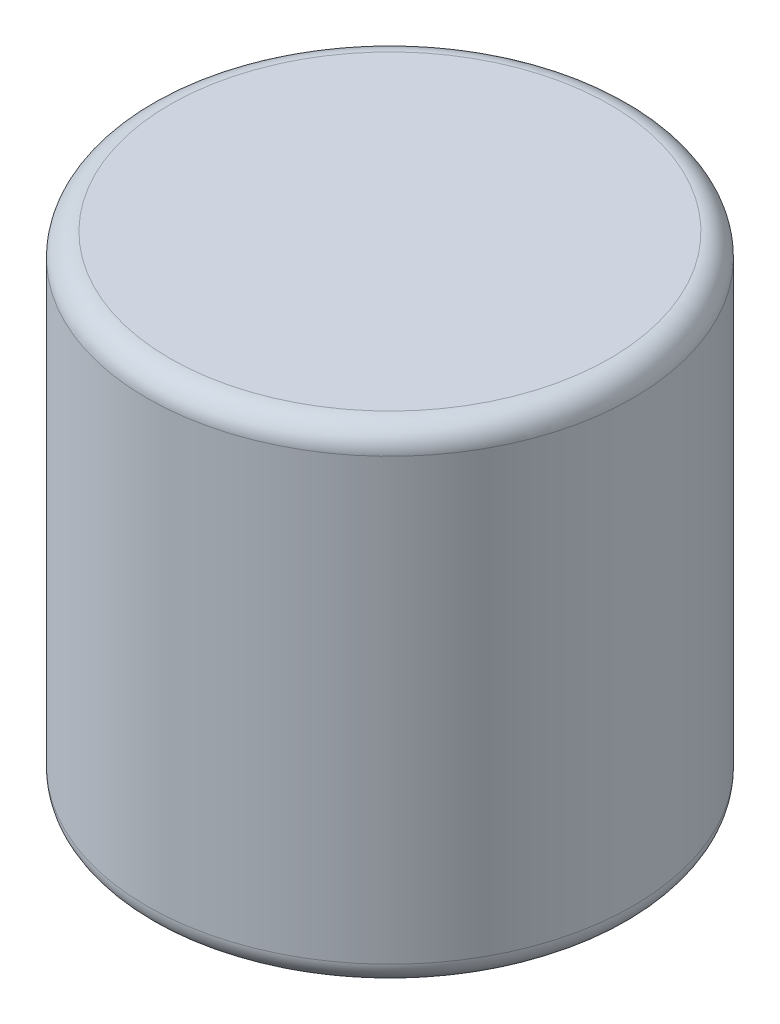
ISO-10303-21;
HEADER;
FILE_DESCRIPTION(('STEP AP214'),'2;1');
FILE_NAME('part.step','',(''),(''),'','','');
FILE_SCHEMA(('AUTOMOTIVE_DESIGN { 1 0 10303 214 1 1 1 1 }'));
ENDSEC;
DATA;
#1=APPLICATION_CONTEXT('core data for automotive mechanical design processes');
#2=APPLICATION_PROTOCOL_DEFINITION('international standard','automotive_design',2000,#1);
#3=PRODUCT_CONTEXT('',#1,'mechanical');
#4=PRODUCT('Part','Part','',(#3));
#5=PRODUCT_RELATED_PRODUCT_CATEGORY('part','',(#4));
#6=PRODUCT_DEFINITION_FORMATION('','',#4);
#7=PRODUCT_DEFINITION_CONTEXT('part definition',#1,'design');
#8=PRODUCT_DEFINITION('design','',#6,#7);
#9=PRODUCT_DEFINITION_SHAPE('','',#8);
#10=(LENGTH_UNIT() NAMED_UNIT(*) SI_UNIT(.MILLI.,.METRE.));
#11=(NAMED_UNIT(*) PLANE_ANGLE_UNIT() SI_UNIT($,.RADIAN.));
#12=(NAMED_UNIT(*) SI_UNIT($,.STERADIAN.) SOLID_ANGLE_UNIT());
#13=UNCERTAINTY_MEASURE_WITH_UNIT(LENGTH_MEASURE(1.E-05),#10,'distance_accuracy_value','');
#14=(GEOMETRIC_REPRESENTATION_CONTEXT(3) GLOBAL_UNCERTAINTY_ASSIGNED_CONTEXT((#13)) GLOBAL_UNIT_ASSIGNED_CONTEXT((#10,
#11,#12)) REPRESENTATION_CONTEXT('',''));
#15=CARTESIAN_POINT('',(0.,0.,0.));
#16=DIRECTION('',(0.,0.,1.));
#17=DIRECTION('',(1.,0.,0.));
#18=AXIS2_PLACEMENT_3D('',#15,#16,#17);
#19=CARTESIAN_POINT('',(0.,6.35,0.));
#20=DIRECTION('',(0.,-1.,0.));
#21=DIRECTION('',(0.,0.,-1.));
#22=AXIS2_PLACEMENT_3D('',#19,#20,#21);
#23=CYLINDRICAL_SURFACE('',#22,3.175);
#24=CARTESIAN_POINT('',(0.,0.3,0.));
#25=DIRECTION('',(0.,1.,0.));
#26=DIRECTION('',(0.,0.,1.));
#27=AXIS2_PLACEMENT_3D('',#24,#25,#26);
#28=CIRCLE('',#27,3.175);
#29=CARTESIAN_POINT('',(0.,0.3,3.175));
#30=VERTEX_POINT('',#29);
#31=EDGE_CURVE('E42',#30,#30,#28,.T.);
#32=ORIENTED_EDGE('',*,*,#31,.T.);
#33=EDGE_LOOP('',(#32));
#34=FACE_BOUND('',#33,.T.);
#35=CARTESIAN_POINT('',(0.,6.05,0.));
#36=DIRECTION('',(0.,1.,0.));
#37=DIRECTION('',(0.,0.,1.));
#38=AXIS2_PLACEMENT_3D('',#35,#36,#37);
#39=CIRCLE('',#38,3.175);
#40=CARTESIAN_POINT('',(0.,6.05,3.175));
#41=VERTEX_POINT('',#40);
#42=EDGE_CURVE('E46',#41,#41,#39,.F.);
#43=ORIENTED_EDGE('',*,*,#42,.T.);
#44=EDGE_LOOP('',(#43));
#45=FACE_BOUND('',#44,.T.);
#46=ADVANCED_FACE('F31',(#34,#45),#23,.T.);
#47=CARTESIAN_POINT('',(0.,6.35,0.));
#48=DIRECTION('',(0.,1.,0.));
#49=DIRECTION('',(0.,0.,1.));
#50=AXIS2_PLACEMENT_3D('',#47,#48,#49);
#51=PLANE('',#50);
#52=CARTESIAN_POINT('',(0.,6.35,0.));
#53=DIRECTION('',(0.,1.,0.));
#54=DIRECTION('',(0.,0.,1.));
#55=AXIS2_PLACEMENT_3D('',#52,#53,#54);
#56=CIRCLE('',#55,2.875);
#57=CARTESIAN_POINT('',(0.,6.35,2.875));
#58=VERTEX_POINT('',#57);
#59=EDGE_CURVE('E10',#58,#58,#56,.T.);
#60=ORIENTED_EDGE('',*,*,#59,.T.);
#61=EDGE_LOOP('',(#60));
#62=FACE_BOUND('',#61,.T.);
#63=ADVANCED_FACE('F62',(#62),#51,.T.);
#64=CARTESIAN_POINT('',(0.,0.,0.));
#65=DIRECTION('',(0.,1.,0.));
#66=DIRECTION('',(0.,0.,1.));
#67=AXIS2_PLACEMENT_3D('',#64,#65,#66);
#68=PLANE('',#67);
#69=CARTESIAN_POINT('',(0.,0.,0.));
#70=DIRECTION('',(0.,1.,0.));
#71=DIRECTION('',(0.,0.,1.));
#72=AXIS2_PLACEMENT_3D('',#69,#70,#71);
#73=CIRCLE('',#72,2.875);
#74=CARTESIAN_POINT('',(0.,0.,2.875));
#75=VERTEX_POINT('',#74);
#76=EDGE_CURVE('E38',#75,#75,#73,.F.);
#77=ORIENTED_EDGE('',*,*,#76,.T.);
#78=EDGE_LOOP('',(#77));
#79=FACE_BOUND('',#78,.T.);
#80=ADVANCED_FACE('F59',(#79),#68,.F.);
#81=CARTESIAN_POINT('',(0.,0.3,0.));
#82=DIRECTION('',(0.,1.,0.));
#83=DIRECTION('',(0.,0.,1.));
#84=AXIS2_PLACEMENT_3D('',#81,#82,#83);
#85=TOROIDAL_SURFACE('',#84,2.875,0.3);
#86=ORIENTED_EDGE('',*,*,#76,.F.);
#87=EDGE_LOOP('',(#86));
#88=FACE_BOUND('',#87,.T.);
#89=ORIENTED_EDGE('',*,*,#31,.F.);
#90=EDGE_LOOP('',(#89));
#91=FACE_BOUND('',#90,.T.);
#92=ADVANCED_FACE('F55',(#88,#91),#85,.T.);
#93=CARTESIAN_POINT('',(0.,6.05,0.));
#94=DIRECTION('',(0.,1.,0.));
#95=DIRECTION('',(0.,0.,1.));
#96=AXIS2_PLACEMENT_3D('',#93,#94,#95);
#97=TOROIDAL_SURFACE('',#96,2.875,0.3);
#98=ORIENTED_EDGE('',*,*,#42,.F.);
#99=EDGE_LOOP('',(#98));
#100=FACE_BOUND('',#99,.T.);
#101=ORIENTED_EDGE('',*,*,#59,.F.);
#102=EDGE_LOOP('',(#101));
#103=FACE_BOUND('',#102,.T.);
#104=ADVANCED_FACE('F33',(#100,#103),#97,.T.);
#105=CLOSED_SHELL('',(#46,#63,#80,#92,#104));
#106=MANIFOLD_SOLID_BREP('B2',#105);
#107=ADVANCED_BREP_SHAPE_REPRESENTATION('',(#18,#106),#14);
#108=SHAPE_DEFINITION_REPRESENTATION(#9,#107);
ENDSEC;
END-ISO-10303-21;
